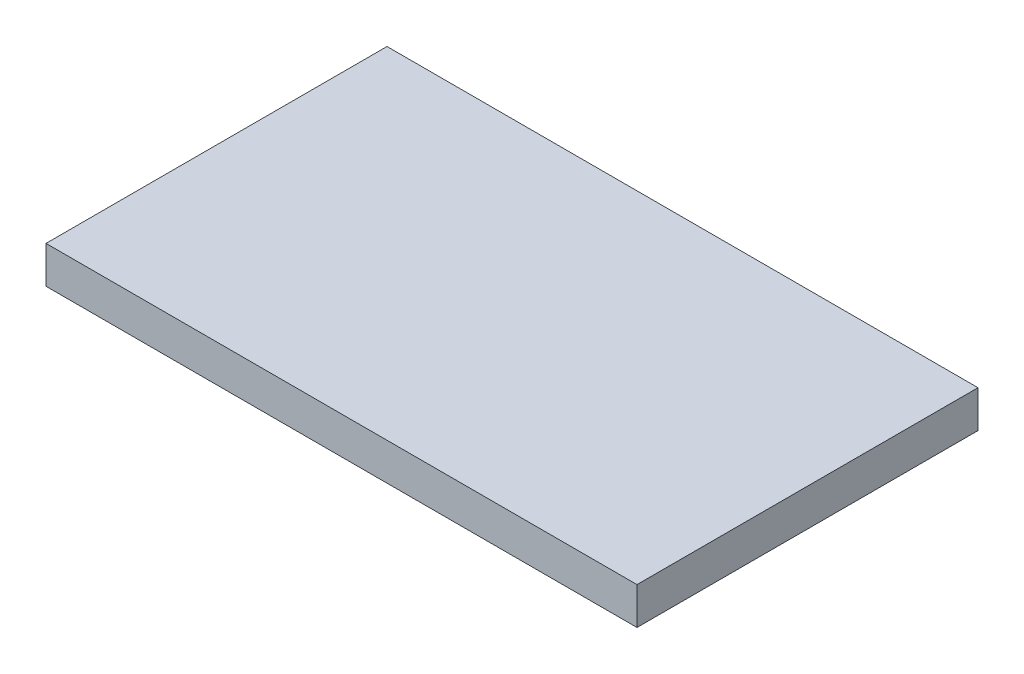
ISO-10303-21;
HEADER;
FILE_DESCRIPTION(('STEP AP214'),'2;1');
FILE_NAME('part.step','',(''),(''),'','','');
FILE_SCHEMA(('AUTOMOTIVE_DESIGN { 1 0 10303 214 1 1 1 1 }'));
ENDSEC;
DATA;
#1=APPLICATION_CONTEXT('core data for automotive mechanical design processes');
#2=APPLICATION_PROTOCOL_DEFINITION('international standard','automotive_design',2000,#1);
#3=PRODUCT_CONTEXT('',#1,'mechanical');
#4=PRODUCT('Part','Part','',(#3));
#5=PRODUCT_RELATED_PRODUCT_CATEGORY('part','',(#4));
#6=PRODUCT_DEFINITION_FORMATION('','',#4);
#7=PRODUCT_DEFINITION_CONTEXT('part definition',#1,'design');
#8=PRODUCT_DEFINITION('design','',#6,#7);
#9=PRODUCT_DEFINITION_SHAPE('','',#8);
#10=(LENGTH_UNIT() NAMED_UNIT(*) SI_UNIT(.MILLI.,.METRE.));
#11=(NAMED_UNIT(*) PLANE_ANGLE_UNIT() SI_UNIT($,.RADIAN.));
#12=(NAMED_UNIT(*) SI_UNIT($,.STERADIAN.) SOLID_ANGLE_UNIT());
#13=UNCERTAINTY_MEASURE_WITH_UNIT(LENGTH_MEASURE(1.E-05),#10,'distance_accuracy_value','');
#14=(GEOMETRIC_REPRESENTATION_CONTEXT(3) GLOBAL_UNCERTAINTY_ASSIGNED_CONTEXT((#13)) GLOBAL_UNIT_ASSIGNED_CONTEXT((#10,
#11,#12)) REPRESENTATION_CONTEXT('',''));
#15=CARTESIAN_POINT('',(0.,0.,0.));
#16=DIRECTION('',(0.,0.,1.));
#17=DIRECTION('',(1.,0.,0.));
#18=AXIS2_PLACEMENT_3D('',#15,#16,#17);
#19=CARTESIAN_POINT('',(64.6220812637457,8.128,37.288459423728));
#20=DIRECTION('',(-1.,0.,0.));
#21=DIRECTION('',(0.,0.,1.));
#22=AXIS2_PLACEMENT_3D('',#19,#20,#21);
#23=PLANE('',#22);
#24=DIRECTION('',(0.,0.,-1.));
#25=VECTOR('',#24,1.);
#26=CARTESIAN_POINT('',(64.6220812637457,0.,37.288459423728));
#27=LINE('',#26,#25);
#28=CARTESIAN_POINT('',(64.6220812637457,0.,37.288459423728));
#29=VERTEX_POINT('',#28);
#30=CARTESIAN_POINT('',(64.6220812637457,0.,-37.288459423728));
#31=VERTEX_POINT('',#30);
#32=EDGE_CURVE('E100',#29,#31,#27,.T.);
#33=ORIENTED_EDGE('',*,*,#32,.T.);
#34=DIRECTION('',(0.,-1.,0.));
#35=VECTOR('',#34,1.);
#36=CARTESIAN_POINT('',(64.6220812637457,8.128,-37.288459423728));
#37=LINE('',#36,#35);
#38=CARTESIAN_POINT('',(64.6220812637457,8.128,-37.288459423728));
#39=VERTEX_POINT('',#38);
#40=EDGE_CURVE('E11',#39,#31,#37,.T.);
#41=ORIENTED_EDGE('',*,*,#40,.F.);
#42=DIRECTION('',(0.,0.,-1.));
#43=VECTOR('',#42,1.);
#44=CARTESIAN_POINT('',(64.6220812637457,8.128,37.288459423728));
#45=LINE('',#44,#43);
#46=CARTESIAN_POINT('',(64.6220812637457,8.128,37.288459423728));
#47=VERTEX_POINT('',#46);
#48=EDGE_CURVE('E88',#47,#39,#45,.T.);
#49=ORIENTED_EDGE('',*,*,#48,.F.);
#50=DIRECTION('',(0.,-1.,0.));
#51=VECTOR('',#50,1.);
#52=CARTESIAN_POINT('',(64.6220812637457,8.128,37.288459423728));
#53=LINE('',#52,#51);
#54=EDGE_CURVE('E96',#47,#29,#53,.T.);
#55=ORIENTED_EDGE('',*,*,#54,.T.);
#56=EDGE_LOOP('',(#33,#41,#49,#55));
#57=FACE_BOUND('',#56,.T.);
#58=ADVANCED_FACE('F37',(#57),#23,.F.);
#59=CARTESIAN_POINT('',(-64.6220812637457,8.128,-37.288459423728));
#60=DIRECTION('',(0.,0.,1.));
#61=DIRECTION('',(1.,0.,0.));
#62=AXIS2_PLACEMENT_3D('',#59,#60,#61);
#63=PLANE('',#62);
#64=DIRECTION('',(-1.,0.,0.));
#65=VECTOR('',#64,1.);
#66=CARTESIAN_POINT('',(-64.6220812637457,0.,-37.288459423728));
#67=LINE('',#66,#65);
#68=CARTESIAN_POINT('',(-64.6220812637457,0.,-37.288459423728));
#69=VERTEX_POINT('',#68);
#70=EDGE_CURVE('E92',#31,#69,#67,.T.);
#71=ORIENTED_EDGE('',*,*,#70,.T.);
#72=DIRECTION('',(0.,-1.,0.));
#73=VECTOR('',#72,1.);
#74=CARTESIAN_POINT('',(-64.6220812637457,8.128,-37.288459423728));
#75=LINE('',#74,#73);
#76=CARTESIAN_POINT('',(-64.6220812637457,8.128,-37.288459423728));
#77=VERTEX_POINT('',#76);
#78=EDGE_CURVE('E45',#77,#69,#75,.T.);
#79=ORIENTED_EDGE('',*,*,#78,.F.);
#80=DIRECTION('',(-1.,0.,0.));
#81=VECTOR('',#80,1.);
#82=CARTESIAN_POINT('',(-64.6220812637457,8.128,-37.288459423728));
#83=LINE('',#82,#81);
#84=EDGE_CURVE('E83',#39,#77,#83,.T.);
#85=ORIENTED_EDGE('',*,*,#84,.F.);
#86=ORIENTED_EDGE('',*,*,#40,.T.);
#87=EDGE_LOOP('',(#71,#79,#85,#86));
#88=FACE_BOUND('',#87,.T.);
#89=ADVANCED_FACE('F91',(#88),#63,.F.);
#90=CARTESIAN_POINT('',(-64.6220812637457,8.128,37.288459423728));
#91=DIRECTION('',(1.,0.,0.));
#92=DIRECTION('',(0.,0.,-1.));
#93=AXIS2_PLACEMENT_3D('',#90,#91,#92);
#94=PLANE('',#93);
#95=DIRECTION('',(0.,0.,1.));
#96=VECTOR('',#95,1.);
#97=CARTESIAN_POINT('',(-64.6220812637457,0.,37.288459423728));
#98=LINE('',#97,#96);
#99=CARTESIAN_POINT('',(-64.6220812637457,0.,37.288459423728));
#100=VERTEX_POINT('',#99);
#101=EDGE_CURVE('E70',#69,#100,#98,.T.);
#102=ORIENTED_EDGE('',*,*,#101,.T.);
#103=DIRECTION('',(0.,-1.,0.));
#104=VECTOR('',#103,1.);
#105=CARTESIAN_POINT('',(-64.6220812637457,8.128,37.288459423728));
#106=LINE('',#105,#104);
#107=CARTESIAN_POINT('',(-64.6220812637457,8.128,37.288459423728));
#108=VERTEX_POINT('',#107);
#109=EDGE_CURVE('E93',#108,#100,#106,.T.);
#110=ORIENTED_EDGE('',*,*,#109,.F.);
#111=DIRECTION('',(0.,0.,1.));
#112=VECTOR('',#111,1.);
#113=CARTESIAN_POINT('',(-64.6220812637457,8.128,37.288459423728));
#114=LINE('',#113,#112);
#115=EDGE_CURVE('E86',#77,#108,#114,.T.);
#116=ORIENTED_EDGE('',*,*,#115,.F.);
#117=ORIENTED_EDGE('',*,*,#78,.T.);
#118=EDGE_LOOP('',(#102,#110,#116,#117));
#119=FACE_BOUND('',#118,.T.);
#120=ADVANCED_FACE('F94',(#119),#94,.F.);
#121=CARTESIAN_POINT('',(-64.6220812637457,8.128,37.288459423728));
#122=DIRECTION('',(0.,0.,-1.));
#123=DIRECTION('',(-1.,0.,0.));
#124=AXIS2_PLACEMENT_3D('',#121,#122,#123);
#125=PLANE('',#124);
#126=DIRECTION('',(1.,0.,0.));
#127=VECTOR('',#126,1.);
#128=CARTESIAN_POINT('',(-64.6220812637457,0.,37.288459423728));
#129=LINE('',#128,#127);
#130=EDGE_CURVE('E76',#100,#29,#129,.T.);
#131=ORIENTED_EDGE('',*,*,#130,.T.);
#132=ORIENTED_EDGE('',*,*,#54,.F.);
#133=DIRECTION('',(1.,0.,0.));
#134=VECTOR('',#133,1.);
#135=CARTESIAN_POINT('',(-64.6220812637457,8.128,37.288459423728));
#136=LINE('',#135,#134);
#137=EDGE_CURVE('E53',#108,#47,#136,.T.);
#138=ORIENTED_EDGE('',*,*,#137,.F.);
#139=ORIENTED_EDGE('',*,*,#109,.T.);
#140=EDGE_LOOP('',(#131,#132,#138,#139));
#141=FACE_BOUND('',#140,.T.);
#142=ADVANCED_FACE('F107',(#141),#125,.F.);
#143=CARTESIAN_POINT('',(0.,8.128,0.));
#144=DIRECTION('',(0.,-1.,0.));
#145=DIRECTION('',(0.,0.,-1.));
#146=AXIS2_PLACEMENT_3D('',#143,#144,#145);
#147=PLANE('',#146);
#148=ORIENTED_EDGE('',*,*,#48,.T.);
#149=ORIENTED_EDGE('',*,*,#84,.T.);
#150=ORIENTED_EDGE('',*,*,#115,.T.);
#151=ORIENTED_EDGE('',*,*,#137,.T.);
#152=EDGE_LOOP('',(#148,#149,#150,#151));
#153=FACE_BOUND('',#152,.T.);
#154=ADVANCED_FACE('F84',(#153),#147,.F.);
#155=CARTESIAN_POINT('',(0.,0.,0.));
#156=DIRECTION('',(0.,-1.,0.));
#157=DIRECTION('',(0.,0.,-1.));
#158=AXIS2_PLACEMENT_3D('',#155,#156,#157);
#159=PLANE('',#158);
#160=ORIENTED_EDGE('',*,*,#32,.F.);
#161=ORIENTED_EDGE('',*,*,#130,.F.);
#162=ORIENTED_EDGE('',*,*,#101,.F.);
#163=ORIENTED_EDGE('',*,*,#70,.F.);
#164=EDGE_LOOP('',(#160,#161,#162,#163));
#165=FACE_BOUND('',#164,.T.);
#166=ADVANCED_FACE('F110',(#165),#159,.T.);
#167=CLOSED_SHELL('',(#58,#89,#120,#142,#154,#166));
#168=MANIFOLD_SOLID_BREP('B2',#167);
#169=ADVANCED_BREP_SHAPE_REPRESENTATION('',(#18,#168),#14);
#170=SHAPE_DEFINITION_REPRESENTATION(#9,#169);
ENDSEC;
END-ISO-10303-21;
